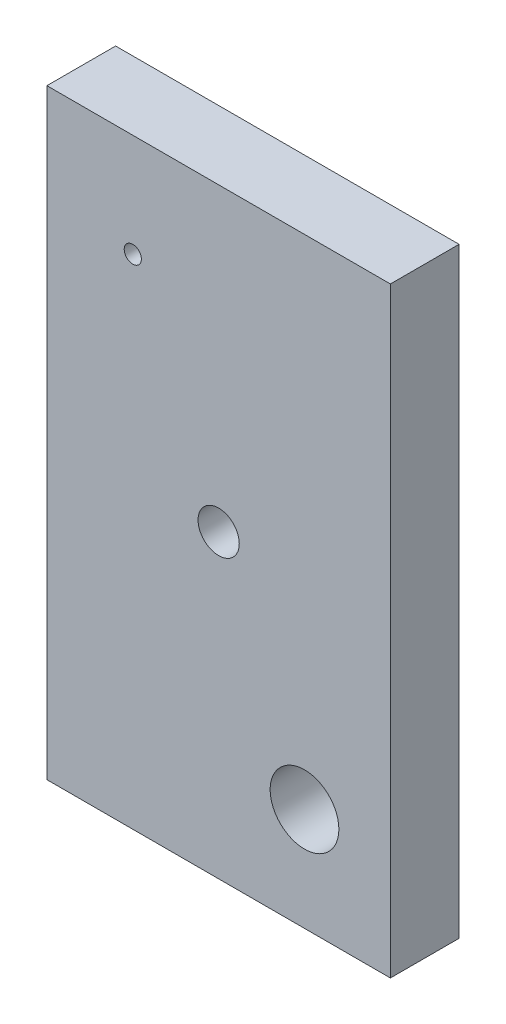
ISO-10303-21;
HEADER;
FILE_DESCRIPTION(('STEP AP214'),'2;1');
FILE_NAME('part.step','',(''),(''),'','','');
FILE_SCHEMA(('AUTOMOTIVE_DESIGN { 1 0 10303 214 1 1 1 1 }'));
ENDSEC;
DATA;
#1=APPLICATION_CONTEXT('core data for automotive mechanical design processes');
#2=APPLICATION_PROTOCOL_DEFINITION('international standard','automotive_design',2000,#1);
#3=PRODUCT_CONTEXT('',#1,'mechanical');
#4=PRODUCT('Part','Part','',(#3));
#5=PRODUCT_RELATED_PRODUCT_CATEGORY('part','',(#4));
#6=PRODUCT_DEFINITION_FORMATION('','',#4);
#7=PRODUCT_DEFINITION_CONTEXT('part definition',#1,'design');
#8=PRODUCT_DEFINITION('design','',#6,#7);
#9=PRODUCT_DEFINITION_SHAPE('','',#8);
#10=(LENGTH_UNIT() NAMED_UNIT(*) SI_UNIT(.MILLI.,.METRE.));
#11=(NAMED_UNIT(*) PLANE_ANGLE_UNIT() SI_UNIT($,.RADIAN.));
#12=(NAMED_UNIT(*) SI_UNIT($,.STERADIAN.) SOLID_ANGLE_UNIT());
#13=UNCERTAINTY_MEASURE_WITH_UNIT(LENGTH_MEASURE(1.E-05),#10,'distance_accuracy_value','');
#14=(GEOMETRIC_REPRESENTATION_CONTEXT(3) GLOBAL_UNCERTAINTY_ASSIGNED_CONTEXT((#13)) GLOBAL_UNIT_ASSIGNED_CONTEXT((#10,
#11,#12)) REPRESENTATION_CONTEXT('',''));
#15=CARTESIAN_POINT('',(0.,0.,0.));
#16=DIRECTION('',(0.,0.,1.));
#17=DIRECTION('',(1.,0.,0.));
#18=AXIS2_PLACEMENT_3D('',#15,#16,#17);
#19=CARTESIAN_POINT('',(0.,0.,-20.));
#20=DIRECTION('',(-1.,0.,0.));
#21=DIRECTION('',(0.,-1.,0.));
#22=AXIS2_PLACEMENT_3D('',#19,#20,#21);
#23=PLANE('',#22);
#24=DIRECTION('',(0.,-1.,0.));
#25=VECTOR('',#24,1.);
#26=CARTESIAN_POINT('',(0.,0.,0.));
#27=LINE('',#26,#25);
#28=CARTESIAN_POINT('',(0.,175.,0.));
#29=VERTEX_POINT('',#28);
#30=CARTESIAN_POINT('',(0.,0.,0.));
#31=VERTEX_POINT('',#30);
#32=EDGE_CURVE('E100',#29,#31,#27,.T.);
#33=ORIENTED_EDGE('',*,*,#32,.F.);
#34=DIRECTION('',(0.,0.,1.));
#35=VECTOR('',#34,1.);
#36=CARTESIAN_POINT('',(0.,175.,-20.));
#37=LINE('',#36,#35);
#38=CARTESIAN_POINT('',(0.,175.,-20.));
#39=VERTEX_POINT('',#38);
#40=EDGE_CURVE('E11',#39,#29,#37,.T.);
#41=ORIENTED_EDGE('',*,*,#40,.F.);
#42=DIRECTION('',(0.,-1.,0.));
#43=VECTOR('',#42,1.);
#44=CARTESIAN_POINT('',(0.,0.,-20.));
#45=LINE('',#44,#43);
#46=CARTESIAN_POINT('',(0.,0.,-20.));
#47=VERTEX_POINT('',#46);
#48=EDGE_CURVE('E93',#39,#47,#45,.T.);
#49=ORIENTED_EDGE('',*,*,#48,.T.);
#50=DIRECTION('',(0.,0.,1.));
#51=VECTOR('',#50,1.);
#52=CARTESIAN_POINT('',(0.,0.,-20.));
#53=LINE('',#52,#51);
#54=EDGE_CURVE('E38',#47,#31,#53,.T.);
#55=ORIENTED_EDGE('',*,*,#54,.T.);
#56=EDGE_LOOP('',(#33,#41,#49,#55));
#57=FACE_BOUND('',#56,.T.);
#58=ADVANCED_FACE('F35',(#57),#23,.T.);
#59=CARTESIAN_POINT('',(0.,175.,-20.));
#60=DIRECTION('',(0.,1.,0.));
#61=DIRECTION('',(0.,0.,1.));
#62=AXIS2_PLACEMENT_3D('',#59,#60,#61);
#63=PLANE('',#62);
#64=DIRECTION('',(-1.,0.,0.));
#65=VECTOR('',#64,1.);
#66=CARTESIAN_POINT('',(0.,175.,0.));
#67=LINE('',#66,#65);
#68=CARTESIAN_POINT('',(100.,175.,0.));
#69=VERTEX_POINT('',#68);
#70=EDGE_CURVE('E95',#69,#29,#67,.T.);
#71=ORIENTED_EDGE('',*,*,#70,.F.);
#72=DIRECTION('',(0.,0.,1.));
#73=VECTOR('',#72,1.);
#74=CARTESIAN_POINT('',(100.,175.,-20.));
#75=LINE('',#74,#73);
#76=CARTESIAN_POINT('',(100.,175.,-20.));
#77=VERTEX_POINT('',#76);
#78=EDGE_CURVE('E44',#77,#69,#75,.T.);
#79=ORIENTED_EDGE('',*,*,#78,.F.);
#80=DIRECTION('',(-1.,0.,0.));
#81=VECTOR('',#80,1.);
#82=CARTESIAN_POINT('',(0.,175.,-20.));
#83=LINE('',#82,#81);
#84=EDGE_CURVE('E90',#77,#39,#83,.T.);
#85=ORIENTED_EDGE('',*,*,#84,.T.);
#86=ORIENTED_EDGE('',*,*,#40,.T.);
#87=EDGE_LOOP('',(#71,#79,#85,#86));
#88=FACE_BOUND('',#87,.T.);
#89=ADVANCED_FACE('F111',(#88),#63,.T.);
#90=CARTESIAN_POINT('',(100.,0.,-20.));
#91=DIRECTION('',(1.,0.,0.));
#92=DIRECTION('',(0.,1.,0.));
#93=AXIS2_PLACEMENT_3D('',#90,#91,#92);
#94=PLANE('',#93);
#95=DIRECTION('',(0.,1.,0.));
#96=VECTOR('',#95,1.);
#97=CARTESIAN_POINT('',(100.,0.,0.));
#98=LINE('',#97,#96);
#99=CARTESIAN_POINT('',(100.,0.,0.));
#100=VERTEX_POINT('',#99);
#101=EDGE_CURVE('E85',#100,#69,#98,.T.);
#102=ORIENTED_EDGE('',*,*,#101,.F.);
#103=DIRECTION('',(0.,0.,1.));
#104=VECTOR('',#103,1.);
#105=CARTESIAN_POINT('',(100.,0.,-20.));
#106=LINE('',#105,#104);
#107=CARTESIAN_POINT('',(100.,0.,-20.));
#108=VERTEX_POINT('',#107);
#109=EDGE_CURVE('E80',#108,#100,#106,.T.);
#110=ORIENTED_EDGE('',*,*,#109,.F.);
#111=DIRECTION('',(0.,1.,0.));
#112=VECTOR('',#111,1.);
#113=CARTESIAN_POINT('',(100.,0.,-20.));
#114=LINE('',#113,#112);
#115=EDGE_CURVE('E83',#108,#77,#114,.T.);
#116=ORIENTED_EDGE('',*,*,#115,.T.);
#117=ORIENTED_EDGE('',*,*,#78,.T.);
#118=EDGE_LOOP('',(#102,#110,#116,#117));
#119=FACE_BOUND('',#118,.T.);
#120=ADVANCED_FACE('F82',(#119),#94,.T.);
#121=CARTESIAN_POINT('',(0.,0.,-20.));
#122=DIRECTION('',(0.,-1.,0.));
#123=DIRECTION('',(0.,0.,-1.));
#124=AXIS2_PLACEMENT_3D('',#121,#122,#123);
#125=PLANE('',#124);
#126=DIRECTION('',(1.,0.,0.));
#127=VECTOR('',#126,1.);
#128=CARTESIAN_POINT('',(0.,0.,0.));
#129=LINE('',#128,#127);
#130=EDGE_CURVE('E103',#31,#100,#129,.T.);
#131=ORIENTED_EDGE('',*,*,#130,.F.);
#132=ORIENTED_EDGE('',*,*,#54,.F.);
#133=DIRECTION('',(1.,0.,0.));
#134=VECTOR('',#133,1.);
#135=CARTESIAN_POINT('',(0.,0.,-20.));
#136=LINE('',#135,#134);
#137=EDGE_CURVE('E89',#47,#108,#136,.T.);
#138=ORIENTED_EDGE('',*,*,#137,.T.);
#139=ORIENTED_EDGE('',*,*,#109,.T.);
#140=EDGE_LOOP('',(#131,#132,#138,#139));
#141=FACE_BOUND('',#140,.T.);
#142=ADVANCED_FACE('F92',(#141),#125,.T.);
#143=CARTESIAN_POINT('',(0.,0.,-20.));
#144=DIRECTION('',(0.,0.,-1.));
#145=DIRECTION('',(-1.,0.,0.));
#146=AXIS2_PLACEMENT_3D('',#143,#144,#145);
#147=PLANE('',#146);
#148=CARTESIAN_POINT('',(75.,30.,-20.));
#149=DIRECTION('',(0.,0.,1.));
#150=DIRECTION('',(1.,0.,0.));
#151=AXIS2_PLACEMENT_3D('',#148,#149,#150);
#152=CIRCLE('',#151,9.99999999999999);
#153=CARTESIAN_POINT('',(85.,30.,-20.));
#154=VERTEX_POINT('',#153);
#155=EDGE_CURVE('E148',#154,#154,#152,.T.);
#156=ORIENTED_EDGE('',*,*,#155,.T.);
#157=EDGE_LOOP('',(#156));
#158=FACE_BOUND('',#157,.T.);
#159=CARTESIAN_POINT('',(50.,87.5,-20.));
#160=DIRECTION('',(0.,0.,1.));
#161=DIRECTION('',(1.,0.,0.));
#162=AXIS2_PLACEMENT_3D('',#159,#160,#161);
#163=CIRCLE('',#162,6.);
#164=CARTESIAN_POINT('',(56.,87.5,-20.));
#165=VERTEX_POINT('',#164);
#166=EDGE_CURVE('E158',#165,#165,#163,.T.);
#167=ORIENTED_EDGE('',*,*,#166,.T.);
#168=EDGE_LOOP('',(#167));
#169=FACE_BOUND('',#168,.T.);
#170=CARTESIAN_POINT('',(25.,145.,-20.));
#171=DIRECTION('',(0.,0.,1.));
#172=DIRECTION('',(1.,0.,0.));
#173=AXIS2_PLACEMENT_3D('',#170,#171,#172);
#174=CIRCLE('',#173,2.5);
#175=CARTESIAN_POINT('',(27.5,145.,-20.));
#176=VERTEX_POINT('',#175);
#177=EDGE_CURVE('E104',#176,#176,#174,.T.);
#178=ORIENTED_EDGE('',*,*,#177,.T.);
#179=EDGE_LOOP('',(#178));
#180=FACE_BOUND('',#179,.T.);
#181=ORIENTED_EDGE('',*,*,#48,.F.);
#182=ORIENTED_EDGE('',*,*,#84,.F.);
#183=ORIENTED_EDGE('',*,*,#115,.F.);
#184=ORIENTED_EDGE('',*,*,#137,.F.);
#185=EDGE_LOOP('',(#181,#182,#183,#184));
#186=FACE_BOUND('',#185,.T.);
#187=ADVANCED_FACE('F88',(#158,#169,#180,#186),#147,.T.);
#188=CARTESIAN_POINT('',(0.,0.,0.));
#189=DIRECTION('',(0.,0.,-1.));
#190=DIRECTION('',(-1.,0.,0.));
#191=AXIS2_PLACEMENT_3D('',#188,#189,#190);
#192=PLANE('',#191);
#193=CARTESIAN_POINT('',(75.,30.,0.));
#194=DIRECTION('',(0.,0.,1.));
#195=DIRECTION('',(1.,0.,0.));
#196=AXIS2_PLACEMENT_3D('',#193,#194,#195);
#197=CIRCLE('',#196,9.99999999999999);
#198=CARTESIAN_POINT('',(85.,30.,0.));
#199=VERTEX_POINT('',#198);
#200=EDGE_CURVE('E151',#199,#199,#197,.T.);
#201=ORIENTED_EDGE('',*,*,#200,.F.);
#202=EDGE_LOOP('',(#201));
#203=FACE_BOUND('',#202,.T.);
#204=CARTESIAN_POINT('',(50.,87.5,0.));
#205=DIRECTION('',(0.,0.,1.));
#206=DIRECTION('',(1.,0.,0.));
#207=AXIS2_PLACEMENT_3D('',#204,#205,#206);
#208=CIRCLE('',#207,6.);
#209=CARTESIAN_POINT('',(56.,87.5,0.));
#210=VERTEX_POINT('',#209);
#211=EDGE_CURVE('E153',#210,#210,#208,.T.);
#212=ORIENTED_EDGE('',*,*,#211,.F.);
#213=EDGE_LOOP('',(#212));
#214=FACE_BOUND('',#213,.T.);
#215=CARTESIAN_POINT('',(25.,145.,0.));
#216=DIRECTION('',(0.,0.,1.));
#217=DIRECTION('',(1.,0.,0.));
#218=AXIS2_PLACEMENT_3D('',#215,#216,#217);
#219=CIRCLE('',#218,2.5);
#220=CARTESIAN_POINT('',(27.5,145.,0.));
#221=VERTEX_POINT('',#220);
#222=EDGE_CURVE('E161',#221,#221,#219,.T.);
#223=ORIENTED_EDGE('',*,*,#222,.F.);
#224=EDGE_LOOP('',(#223));
#225=FACE_BOUND('',#224,.T.);
#226=ORIENTED_EDGE('',*,*,#32,.T.);
#227=ORIENTED_EDGE('',*,*,#130,.T.);
#228=ORIENTED_EDGE('',*,*,#101,.T.);
#229=ORIENTED_EDGE('',*,*,#70,.T.);
#230=EDGE_LOOP('',(#226,#227,#228,#229));
#231=FACE_BOUND('',#230,.T.);
#232=ADVANCED_FACE('F110',(#203,#214,#225,#231),#192,.F.);
#233=CARTESIAN_POINT('',(25.,145.,0.));
#234=DIRECTION('',(0.,0.,1.));
#235=DIRECTION('',(1.,0.,0.));
#236=AXIS2_PLACEMENT_3D('',#233,#234,#235);
#237=CYLINDRICAL_SURFACE('',#236,2.5);
#238=ORIENTED_EDGE('',*,*,#177,.F.);
#239=EDGE_LOOP('',(#238));
#240=FACE_BOUND('',#239,.T.);
#241=ORIENTED_EDGE('',*,*,#222,.T.);
#242=EDGE_LOOP('',(#241));
#243=FACE_BOUND('',#242,.T.);
#244=ADVANCED_FACE('F129',(#240,#243),#237,.F.);
#245=CARTESIAN_POINT('',(50.,87.5,0.));
#246=DIRECTION('',(0.,0.,1.));
#247=DIRECTION('',(1.,0.,0.));
#248=AXIS2_PLACEMENT_3D('',#245,#246,#247);
#249=CYLINDRICAL_SURFACE('',#248,6.);
#250=ORIENTED_EDGE('',*,*,#166,.F.);
#251=EDGE_LOOP('',(#250));
#252=FACE_BOUND('',#251,.T.);
#253=ORIENTED_EDGE('',*,*,#211,.T.);
#254=EDGE_LOOP('',(#253));
#255=FACE_BOUND('',#254,.T.);
#256=ADVANCED_FACE('F136',(#252,#255),#249,.F.);
#257=CARTESIAN_POINT('',(75.,30.,0.));
#258=DIRECTION('',(0.,0.,1.));
#259=DIRECTION('',(1.,0.,0.));
#260=AXIS2_PLACEMENT_3D('',#257,#258,#259);
#261=CYLINDRICAL_SURFACE('',#260,9.99999999999999);
#262=ORIENTED_EDGE('',*,*,#155,.F.);
#263=EDGE_LOOP('',(#262));
#264=FACE_BOUND('',#263,.T.);
#265=ORIENTED_EDGE('',*,*,#200,.T.);
#266=EDGE_LOOP('',(#265));
#267=FACE_BOUND('',#266,.T.);
#268=ADVANCED_FACE('F140',(#264,#267),#261,.F.);
#269=CLOSED_SHELL('',(#58,#89,#120,#142,#187,#232,#244,#256,#268));
#270=MANIFOLD_SOLID_BREP('B2',#269);
#271=ADVANCED_BREP_SHAPE_REPRESENTATION('',(#18,#270),#14);
#272=SHAPE_DEFINITION_REPRESENTATION(#9,#271);
ENDSEC;
END-ISO-10303-21;
